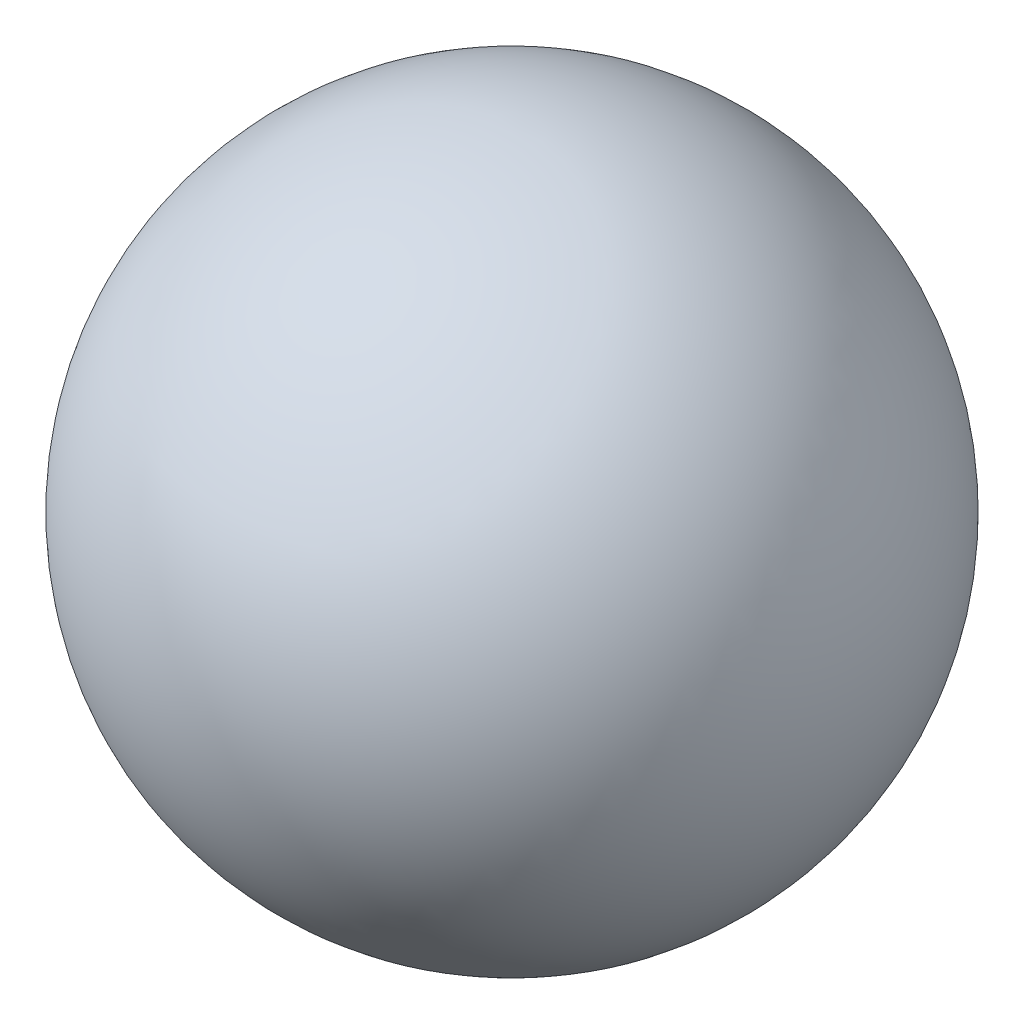
ISO-10303-21;
HEADER;
FILE_DESCRIPTION(('STEP AP214'),'2;1');
FILE_NAME('part.step','',(''),(''),'','','');
FILE_SCHEMA(('AUTOMOTIVE_DESIGN { 1 0 10303 214 1 1 1 1 }'));
ENDSEC;
DATA;
#1=APPLICATION_CONTEXT('core data for automotive mechanical design processes');
#2=APPLICATION_PROTOCOL_DEFINITION('international standard','automotive_design',2000,#1);
#3=PRODUCT_CONTEXT('',#1,'mechanical');
#4=PRODUCT('Part','Part','',(#3));
#5=PRODUCT_RELATED_PRODUCT_CATEGORY('part','',(#4));
#6=PRODUCT_DEFINITION_FORMATION('','',#4);
#7=PRODUCT_DEFINITION_CONTEXT('part definition',#1,'design');
#8=PRODUCT_DEFINITION('design','',#6,#7);
#9=PRODUCT_DEFINITION_SHAPE('','',#8);
#10=(LENGTH_UNIT() NAMED_UNIT(*) SI_UNIT(.MILLI.,.METRE.));
#11=(NAMED_UNIT(*) PLANE_ANGLE_UNIT() SI_UNIT($,.RADIAN.));
#12=(NAMED_UNIT(*) SI_UNIT($,.STERADIAN.) SOLID_ANGLE_UNIT());
#13=UNCERTAINTY_MEASURE_WITH_UNIT(LENGTH_MEASURE(1.E-05),#10,'distance_accuracy_value','');
#14=(GEOMETRIC_REPRESENTATION_CONTEXT(3) GLOBAL_UNCERTAINTY_ASSIGNED_CONTEXT((#13)) GLOBAL_UNIT_ASSIGNED_CONTEXT((#10,
#11,#12)) REPRESENTATION_CONTEXT('',''));
#15=CARTESIAN_POINT('',(0.,0.,0.));
#16=DIRECTION('',(0.,0.,1.));
#17=DIRECTION('',(1.,0.,0.));
#18=AXIS2_PLACEMENT_3D('',#15,#16,#17);
#19=CARTESIAN_POINT('',(0.,0.,0.));
#20=DIRECTION('',(0.,-1.,0.));
#21=DIRECTION('',(-1.,0.,0.));
#22=AXIS2_PLACEMENT_3D('',#19,#20,#21);
#23=SPHERICAL_SURFACE('',#22,33.5);
#24=CARTESIAN_POINT('',(0.,-33.5,0.));
#25=VERTEX_POINT('',#24);
#26=VERTEX_LOOP('',#25);
#27=FACE_BOUND('',#26,.T.);
#28=ADVANCED_FACE('F35',(#27),#23,.T.);
#29=CLOSED_SHELL('',(#28));
#30=MANIFOLD_SOLID_BREP('B2',#29);
#31=ADVANCED_BREP_SHAPE_REPRESENTATION('',(#18,#30),#14);
#32=SHAPE_DEFINITION_REPRESENTATION(#9,#31);
ENDSEC;
END-ISO-10303-21;
